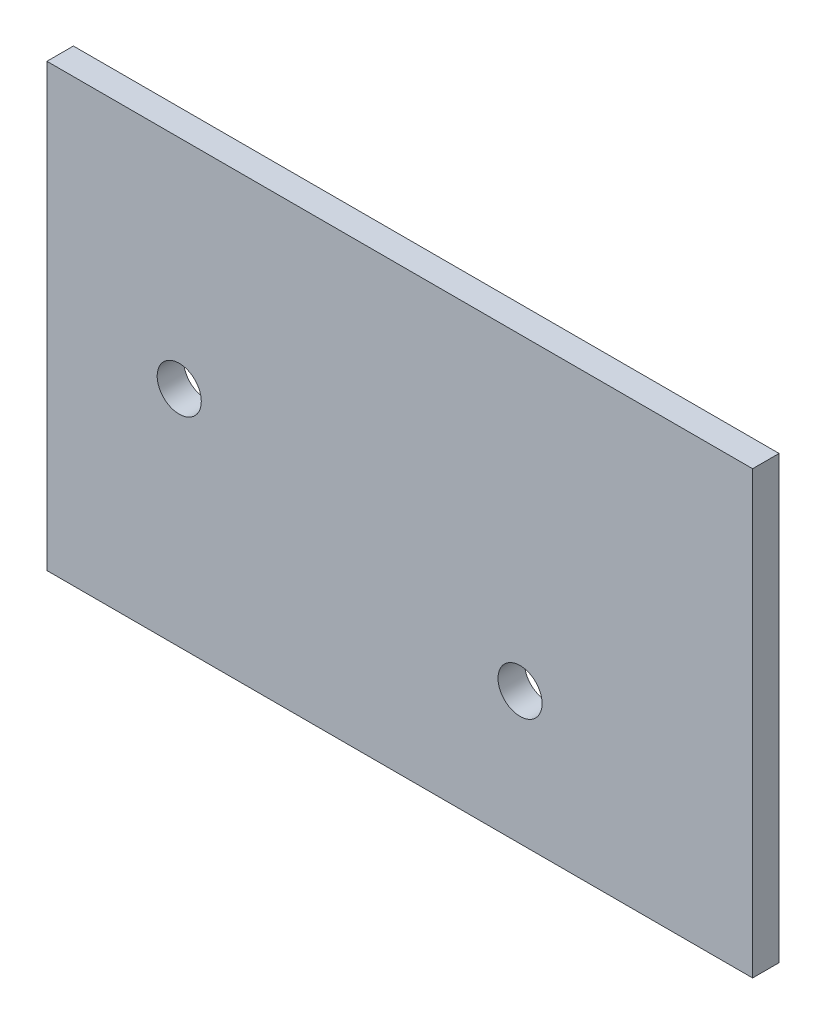
ISO-10303-21;
HEADER;
FILE_DESCRIPTION(('STEP AP214'),'2;1');
FILE_NAME('part.step','',(''),(''),'','','');
FILE_SCHEMA(('AUTOMOTIVE_DESIGN { 1 0 10303 214 1 1 1 1 }'));
ENDSEC;
DATA;
#1=APPLICATION_CONTEXT('core data for automotive mechanical design processes');
#2=APPLICATION_PROTOCOL_DEFINITION('international standard','automotive_design',2000,#1);
#3=PRODUCT_CONTEXT('',#1,'mechanical');
#4=PRODUCT('Part','Part','',(#3));
#5=PRODUCT_RELATED_PRODUCT_CATEGORY('part','',(#4));
#6=PRODUCT_DEFINITION_FORMATION('','',#4);
#7=PRODUCT_DEFINITION_CONTEXT('part definition',#1,'design');
#8=PRODUCT_DEFINITION('design','',#6,#7);
#9=PRODUCT_DEFINITION_SHAPE('','',#8);
#10=(LENGTH_UNIT() NAMED_UNIT(*) SI_UNIT(.MILLI.,.METRE.));
#11=(NAMED_UNIT(*) PLANE_ANGLE_UNIT() SI_UNIT($,.RADIAN.));
#12=(NAMED_UNIT(*) SI_UNIT($,.STERADIAN.) SOLID_ANGLE_UNIT());
#13=UNCERTAINTY_MEASURE_WITH_UNIT(LENGTH_MEASURE(1.E-05),#10,'distance_accuracy_value','');
#14=(GEOMETRIC_REPRESENTATION_CONTEXT(3) GLOBAL_UNCERTAINTY_ASSIGNED_CONTEXT((#13)) GLOBAL_UNIT_ASSIGNED_CONTEXT((#10,
#11,#12)) REPRESENTATION_CONTEXT('',''));
#15=CARTESIAN_POINT('',(0.,0.,0.));
#16=DIRECTION('',(0.,0.,1.));
#17=DIRECTION('',(1.,0.,0.));
#18=AXIS2_PLACEMENT_3D('',#15,#16,#17);
#19=CARTESIAN_POINT('',(65.,35.,3.));
#20=DIRECTION('',(-1.,0.,0.));
#21=DIRECTION('',(0.,-1.,0.));
#22=AXIS2_PLACEMENT_3D('',#19,#20,#21);
#23=PLANE('',#22);
#24=DIRECTION('',(0.,1.,0.));
#25=VECTOR('',#24,1.);
#26=CARTESIAN_POINT('',(65.,35.,0.));
#27=LINE('',#26,#25);
#28=CARTESIAN_POINT('',(65.,-15.,0.));
#29=VERTEX_POINT('',#28);
#30=CARTESIAN_POINT('',(65.,35.,0.));
#31=VERTEX_POINT('',#30);
#32=EDGE_CURVE('E96',#29,#31,#27,.T.);
#33=ORIENTED_EDGE('',*,*,#32,.T.);
#34=DIRECTION('',(0.,0.,-1.));
#35=VECTOR('',#34,1.);
#36=CARTESIAN_POINT('',(65.,35.,3.));
#37=LINE('',#36,#35);
#38=CARTESIAN_POINT('',(65.,35.,3.));
#39=VERTEX_POINT('',#38);
#40=EDGE_CURVE('E11',#39,#31,#37,.T.);
#41=ORIENTED_EDGE('',*,*,#40,.F.);
#42=DIRECTION('',(0.,1.,0.));
#43=VECTOR('',#42,1.);
#44=CARTESIAN_POINT('',(65.,35.,3.));
#45=LINE('',#44,#43);
#46=CARTESIAN_POINT('',(65.,-15.,3.));
#47=VERTEX_POINT('',#46);
#48=EDGE_CURVE('E84',#47,#39,#45,.T.);
#49=ORIENTED_EDGE('',*,*,#48,.F.);
#50=DIRECTION('',(0.,0.,-1.));
#51=VECTOR('',#50,1.);
#52=CARTESIAN_POINT('',(65.,-15.,3.));
#53=LINE('',#52,#51);
#54=EDGE_CURVE('E92',#47,#29,#53,.T.);
#55=ORIENTED_EDGE('',*,*,#54,.T.);
#56=EDGE_LOOP('',(#33,#41,#49,#55));
#57=FACE_BOUND('',#56,.T.);
#58=ADVANCED_FACE('F33',(#57),#23,.F.);
#59=CARTESIAN_POINT('',(-15.,35.,3.));
#60=DIRECTION('',(0.,-1.,0.));
#61=DIRECTION('',(0.,0.,-1.));
#62=AXIS2_PLACEMENT_3D('',#59,#60,#61);
#63=PLANE('',#62);
#64=DIRECTION('',(-1.,0.,0.));
#65=VECTOR('',#64,1.);
#66=CARTESIAN_POINT('',(-15.,35.,0.));
#67=LINE('',#66,#65);
#68=CARTESIAN_POINT('',(-15.,35.,0.));
#69=VERTEX_POINT('',#68);
#70=EDGE_CURVE('E88',#31,#69,#67,.T.);
#71=ORIENTED_EDGE('',*,*,#70,.T.);
#72=DIRECTION('',(0.,0.,-1.));
#73=VECTOR('',#72,1.);
#74=CARTESIAN_POINT('',(-15.,35.,3.));
#75=LINE('',#74,#73);
#76=CARTESIAN_POINT('',(-15.,35.,3.));
#77=VERTEX_POINT('',#76);
#78=EDGE_CURVE('E41',#77,#69,#75,.T.);
#79=ORIENTED_EDGE('',*,*,#78,.F.);
#80=DIRECTION('',(-1.,0.,0.));
#81=VECTOR('',#80,1.);
#82=CARTESIAN_POINT('',(-15.,35.,3.));
#83=LINE('',#82,#81);
#84=EDGE_CURVE('E79',#39,#77,#83,.T.);
#85=ORIENTED_EDGE('',*,*,#84,.F.);
#86=ORIENTED_EDGE('',*,*,#40,.T.);
#87=EDGE_LOOP('',(#71,#79,#85,#86));
#88=FACE_BOUND('',#87,.T.);
#89=ADVANCED_FACE('F87',(#88),#63,.F.);
#90=CARTESIAN_POINT('',(-15.,35.,3.));
#91=DIRECTION('',(1.,0.,0.));
#92=DIRECTION('',(0.,1.,0.));
#93=AXIS2_PLACEMENT_3D('',#90,#91,#92);
#94=PLANE('',#93);
#95=DIRECTION('',(0.,-1.,0.));
#96=VECTOR('',#95,1.);
#97=CARTESIAN_POINT('',(-15.,35.,0.));
#98=LINE('',#97,#96);
#99=CARTESIAN_POINT('',(-15.,-15.,0.));
#100=VERTEX_POINT('',#99);
#101=EDGE_CURVE('E66',#69,#100,#98,.T.);
#102=ORIENTED_EDGE('',*,*,#101,.T.);
#103=DIRECTION('',(0.,0.,-1.));
#104=VECTOR('',#103,1.);
#105=CARTESIAN_POINT('',(-15.,-15.,3.));
#106=LINE('',#105,#104);
#107=CARTESIAN_POINT('',(-15.,-15.,3.));
#108=VERTEX_POINT('',#107);
#109=EDGE_CURVE('E89',#108,#100,#106,.T.);
#110=ORIENTED_EDGE('',*,*,#109,.F.);
#111=DIRECTION('',(0.,-1.,0.));
#112=VECTOR('',#111,1.);
#113=CARTESIAN_POINT('',(-15.,35.,3.));
#114=LINE('',#113,#112);
#115=EDGE_CURVE('E82',#77,#108,#114,.T.);
#116=ORIENTED_EDGE('',*,*,#115,.F.);
#117=ORIENTED_EDGE('',*,*,#78,.T.);
#118=EDGE_LOOP('',(#102,#110,#116,#117));
#119=FACE_BOUND('',#118,.T.);
#120=ADVANCED_FACE('F90',(#119),#94,.F.);
#121=CARTESIAN_POINT('',(-15.,-15.,3.));
#122=DIRECTION('',(0.,1.,0.));
#123=DIRECTION('',(0.,0.,1.));
#124=AXIS2_PLACEMENT_3D('',#121,#122,#123);
#125=PLANE('',#124);
#126=DIRECTION('',(1.,0.,0.));
#127=VECTOR('',#126,1.);
#128=CARTESIAN_POINT('',(-15.,-15.,0.));
#129=LINE('',#128,#127);
#130=EDGE_CURVE('E72',#100,#29,#129,.T.);
#131=ORIENTED_EDGE('',*,*,#130,.T.);
#132=ORIENTED_EDGE('',*,*,#54,.F.);
#133=DIRECTION('',(1.,0.,0.));
#134=VECTOR('',#133,1.);
#135=CARTESIAN_POINT('',(-15.,-15.,3.));
#136=LINE('',#135,#134);
#137=EDGE_CURVE('E49',#108,#47,#136,.T.);
#138=ORIENTED_EDGE('',*,*,#137,.F.);
#139=ORIENTED_EDGE('',*,*,#109,.T.);
#140=EDGE_LOOP('',(#131,#132,#138,#139));
#141=FACE_BOUND('',#140,.T.);
#142=ADVANCED_FACE('F104',(#141),#125,.F.);
#143=CARTESIAN_POINT('',(65.,-15.,3.));
#144=DIRECTION('',(0.,0.,1.));
#145=DIRECTION('',(1.,0.,0.));
#146=AXIS2_PLACEMENT_3D('',#143,#144,#145);
#147=PLANE('',#146);
#148=CARTESIAN_POINT('',(38.6370330515628,0.,3.));
#149=DIRECTION('',(0.,0.,1.));
#150=DIRECTION('',(1.,0.,0.));
#151=AXIS2_PLACEMENT_3D('',#148,#149,#150);
#152=CIRCLE('',#151,2.49999999999999);
#153=CARTESIAN_POINT('',(41.1370330515628,0.,3.));
#154=VERTEX_POINT('',#153);
#155=EDGE_CURVE('E116',#154,#154,#152,.T.);
#156=ORIENTED_EDGE('',*,*,#155,.F.);
#157=EDGE_LOOP('',(#156));
#158=FACE_BOUND('',#157,.T.);
#159=CARTESIAN_POINT('',(0.,10.3527618041006,3.));
#160=DIRECTION('',(0.,0.,1.));
#161=DIRECTION('',(1.,0.,0.));
#162=AXIS2_PLACEMENT_3D('',#159,#160,#161);
#163=CIRCLE('',#162,2.5);
#164=CARTESIAN_POINT('',(2.5,10.3527618041006,3.));
#165=VERTEX_POINT('',#164);
#166=EDGE_CURVE('E110',#165,#165,#163,.T.);
#167=ORIENTED_EDGE('',*,*,#166,.F.);
#168=EDGE_LOOP('',(#167));
#169=FACE_BOUND('',#168,.T.);
#170=ORIENTED_EDGE('',*,*,#48,.T.);
#171=ORIENTED_EDGE('',*,*,#84,.T.);
#172=ORIENTED_EDGE('',*,*,#115,.T.);
#173=ORIENTED_EDGE('',*,*,#137,.T.);
#174=EDGE_LOOP('',(#170,#171,#172,#173));
#175=FACE_BOUND('',#174,.T.);
#176=ADVANCED_FACE('F80',(#158,#169,#175),#147,.T.);
#177=CARTESIAN_POINT('',(65.,-15.,0.));
#178=DIRECTION('',(0.,0.,1.));
#179=DIRECTION('',(1.,0.,0.));
#180=AXIS2_PLACEMENT_3D('',#177,#178,#179);
#181=PLANE('',#180);
#182=CARTESIAN_POINT('',(38.6370330515628,0.,0.));
#183=DIRECTION('',(0.,0.,1.));
#184=DIRECTION('',(1.,0.,0.));
#185=AXIS2_PLACEMENT_3D('',#182,#183,#184);
#186=CIRCLE('',#185,2.49999999999999);
#187=CARTESIAN_POINT('',(41.1370330515628,0.,0.));
#188=VERTEX_POINT('',#187);
#189=EDGE_CURVE('E113',#188,#188,#186,.T.);
#190=ORIENTED_EDGE('',*,*,#189,.T.);
#191=EDGE_LOOP('',(#190));
#192=FACE_BOUND('',#191,.T.);
#193=CARTESIAN_POINT('',(0.,10.3527618041006,0.));
#194=DIRECTION('',(0.,0.,1.));
#195=DIRECTION('',(1.,0.,0.));
#196=AXIS2_PLACEMENT_3D('',#193,#194,#195);
#197=CIRCLE('',#196,2.5);
#198=CARTESIAN_POINT('',(2.5,10.3527618041006,0.));
#199=VERTEX_POINT('',#198);
#200=EDGE_CURVE('E99',#199,#199,#197,.T.);
#201=ORIENTED_EDGE('',*,*,#200,.T.);
#202=EDGE_LOOP('',(#201));
#203=FACE_BOUND('',#202,.T.);
#204=ORIENTED_EDGE('',*,*,#32,.F.);
#205=ORIENTED_EDGE('',*,*,#130,.F.);
#206=ORIENTED_EDGE('',*,*,#101,.F.);
#207=ORIENTED_EDGE('',*,*,#70,.F.);
#208=EDGE_LOOP('',(#204,#205,#206,#207));
#209=FACE_BOUND('',#208,.T.);
#210=ADVANCED_FACE('F107',(#192,#203,#209),#181,.F.);
#211=CARTESIAN_POINT('',(0.,10.3527618041006,0.));
#212=DIRECTION('',(0.,0.,1.));
#213=DIRECTION('',(1.,0.,0.));
#214=AXIS2_PLACEMENT_3D('',#211,#212,#213);
#215=CYLINDRICAL_SURFACE('',#214,2.5);
#216=ORIENTED_EDGE('',*,*,#200,.F.);
#217=EDGE_LOOP('',(#216));
#218=FACE_BOUND('',#217,.T.);
#219=ORIENTED_EDGE('',*,*,#166,.T.);
#220=EDGE_LOOP('',(#219));
#221=FACE_BOUND('',#220,.T.);
#222=ADVANCED_FACE('F127',(#218,#221),#215,.F.);
#223=CARTESIAN_POINT('',(38.6370330515628,0.,0.));
#224=DIRECTION('',(0.,0.,1.));
#225=DIRECTION('',(1.,0.,0.));
#226=AXIS2_PLACEMENT_3D('',#223,#224,#225);
#227=CYLINDRICAL_SURFACE('',#226,2.49999999999999);
#228=ORIENTED_EDGE('',*,*,#189,.F.);
#229=EDGE_LOOP('',(#228));
#230=FACE_BOUND('',#229,.T.);
#231=ORIENTED_EDGE('',*,*,#155,.T.);
#232=EDGE_LOOP('',(#231));
#233=FACE_BOUND('',#232,.T.);
#234=ADVANCED_FACE('F124',(#230,#233),#227,.F.);
#235=CLOSED_SHELL('',(#58,#89,#120,#142,#176,#210,#222,#234));
#236=MANIFOLD_SOLID_BREP('B2',#235);
#237=ADVANCED_BREP_SHAPE_REPRESENTATION('',(#18,#236),#14);
#238=SHAPE_DEFINITION_REPRESENTATION(#9,#237);
ENDSEC;
END-ISO-10303-21;
